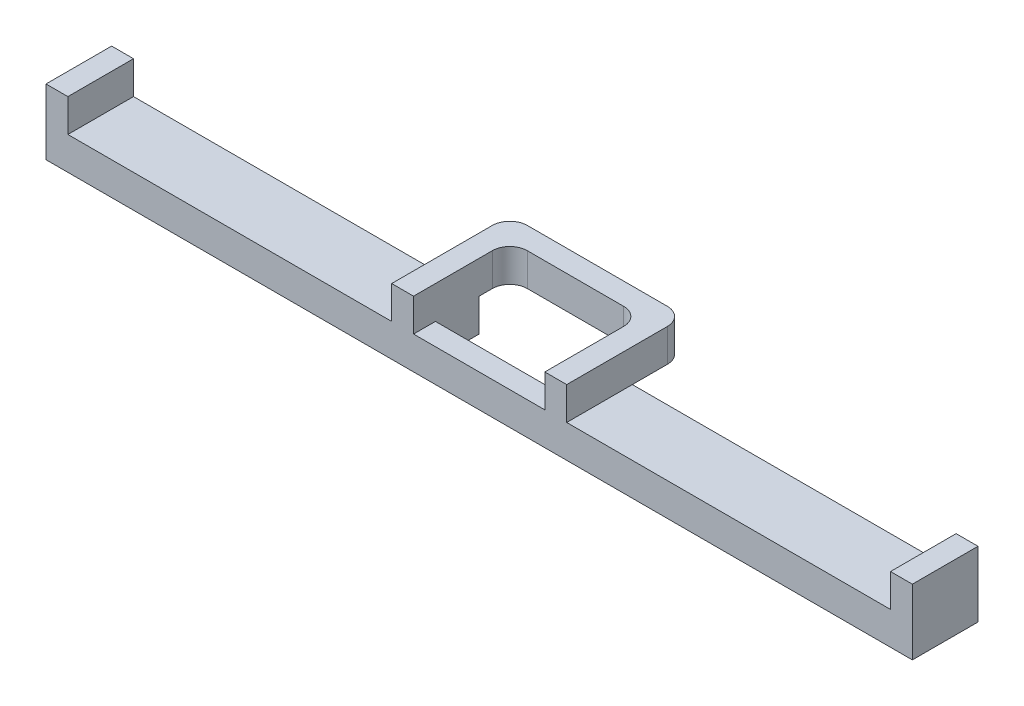
ISO-10303-21;
HEADER;
FILE_DESCRIPTION(('STEP AP214'),'2;1');
FILE_NAME('part.step','',(''),(''),'','','');
FILE_SCHEMA(('AUTOMOTIVE_DESIGN { 1 0 10303 214 1 1 1 1 }'));
ENDSEC;
DATA;
#1=APPLICATION_CONTEXT('core data for automotive mechanical design processes');
#2=APPLICATION_PROTOCOL_DEFINITION('international standard','automotive_design',2000,#1);
#3=PRODUCT_CONTEXT('',#1,'mechanical');
#4=PRODUCT('Part','Part','',(#3));
#5=PRODUCT_RELATED_PRODUCT_CATEGORY('part','',(#4));
#6=PRODUCT_DEFINITION_FORMATION('','',#4);
#7=PRODUCT_DEFINITION_CONTEXT('part definition',#1,'design');
#8=PRODUCT_DEFINITION('design','',#6,#7);
#9=PRODUCT_DEFINITION_SHAPE('','',#8);
#10=(LENGTH_UNIT() NAMED_UNIT(*) SI_UNIT(.MILLI.,.METRE.));
#11=(NAMED_UNIT(*) PLANE_ANGLE_UNIT() SI_UNIT($,.RADIAN.));
#12=(NAMED_UNIT(*) SI_UNIT($,.STERADIAN.) SOLID_ANGLE_UNIT());
#13=UNCERTAINTY_MEASURE_WITH_UNIT(LENGTH_MEASURE(1.E-05),#10,'distance_accuracy_value','');
#14=(GEOMETRIC_REPRESENTATION_CONTEXT(3) GLOBAL_UNCERTAINTY_ASSIGNED_CONTEXT((#13)) GLOBAL_UNIT_ASSIGNED_CONTEXT((#10,
#11,#12)) REPRESENTATION_CONTEXT('',''));
#15=CARTESIAN_POINT('',(0.,0.,0.));
#16=DIRECTION('',(0.,0.,1.));
#17=DIRECTION('',(1.,0.,0.));
#18=AXIS2_PLACEMENT_3D('',#15,#16,#17);
#19=CARTESIAN_POINT('',(0.,0.,0.));
#20=DIRECTION('',(0.,0.,-1.));
#21=DIRECTION('',(-1.,0.,0.));
#22=AXIS2_PLACEMENT_3D('',#19,#20,#21);
#23=PLANE('',#22);
#24=DIRECTION('',(-1.,0.,0.));
#25=VECTOR('',#24,1.);
#26=CARTESIAN_POINT('',(-94.,0.,0.));
#27=LINE('',#26,#25);
#28=CARTESIAN_POINT('',(-20.,0.,0.));
#29=VERTEX_POINT('',#28);
#30=CARTESIAN_POINT('',(-94.,0.,0.));
#31=VERTEX_POINT('',#30);
#32=EDGE_CURVE('E357',#29,#31,#27,.T.);
#33=ORIENTED_EDGE('',*,*,#32,.F.);
#34=DIRECTION('',(1.,0.,0.));
#35=VECTOR('',#34,1.);
#36=CARTESIAN_POINT('',(0.,0.,0.));
#37=LINE('',#36,#35);
#38=CARTESIAN_POINT('',(-15.,0.,0.));
#39=VERTEX_POINT('',#38);
#40=EDGE_CURVE('E232',#29,#39,#37,.T.);
#41=ORIENTED_EDGE('',*,*,#40,.T.);
#42=DIRECTION('',(0.,1.,0.));
#43=VECTOR('',#42,1.);
#44=CARTESIAN_POINT('',(-15.,7.50000000000001,0.));
#45=LINE('',#44,#43);
#46=CARTESIAN_POINT('',(-15.,-7.50000000000003,0.));
#47=VERTEX_POINT('',#46);
#48=EDGE_CURVE('E305',#47,#39,#45,.T.);
#49=ORIENTED_EDGE('',*,*,#48,.F.);
#50=DIRECTION('',(1.,0.,0.));
#51=VECTOR('',#50,1.);
#52=CARTESIAN_POINT('',(99.,-7.49999999999999,0.));
#53=LINE('',#52,#51);
#54=CARTESIAN_POINT('',(-99.,-7.50000000000001,0.));
#55=VERTEX_POINT('',#54);
#56=EDGE_CURVE('E348',#55,#47,#53,.T.);
#57=ORIENTED_EDGE('',*,*,#56,.F.);
#58=DIRECTION('',(0.,-1.,0.));
#59=VECTOR('',#58,1.);
#60=CARTESIAN_POINT('',(-99.,7.49999999999999,0.));
#61=LINE('',#60,#59);
#62=CARTESIAN_POINT('',(-99.,7.49999999999999,0.));
#63=VERTEX_POINT('',#62);
#64=EDGE_CURVE('E322',#63,#55,#61,.T.);
#65=ORIENTED_EDGE('',*,*,#64,.F.);
#66=DIRECTION('',(-1.,0.,0.));
#67=VECTOR('',#66,1.);
#68=CARTESIAN_POINT('',(-94.,7.49999999999999,0.));
#69=LINE('',#68,#67);
#70=CARTESIAN_POINT('',(-94.,7.49999999999999,0.));
#71=VERTEX_POINT('',#70);
#72=EDGE_CURVE('E327',#71,#63,#69,.T.);
#73=ORIENTED_EDGE('',*,*,#72,.F.);
#74=DIRECTION('',(0.,1.,0.));
#75=VECTOR('',#74,1.);
#76=CARTESIAN_POINT('',(-94.,7.49999999999999,0.));
#77=LINE('',#76,#75);
#78=EDGE_CURVE('E361',#31,#71,#77,.T.);
#79=ORIENTED_EDGE('',*,*,#78,.F.);
#80=EDGE_LOOP('',(#33,#41,#49,#57,#65,#73,#79));
#81=FACE_BOUND('',#80,.T.);
#82=ADVANCED_FACE('F35',(#81),#23,.T.);
#83=DIRECTION('',(0.,-1.,0.));
#84=VECTOR('',#83,1.);
#85=CARTESIAN_POINT('',(15.,7.50000000000002,0.));
#86=LINE('',#85,#84);
#87=CARTESIAN_POINT('',(15.,0.,0.));
#88=VERTEX_POINT('',#87);
#89=CARTESIAN_POINT('',(15.,-7.50000000000003,0.));
#90=VERTEX_POINT('',#89);
#91=EDGE_CURVE('E308',#88,#90,#86,.T.);
#92=ORIENTED_EDGE('',*,*,#91,.F.);
#93=DIRECTION('',(1.,0.,0.));
#94=VECTOR('',#93,1.);
#95=CARTESIAN_POINT('',(20.,0.,0.));
#96=LINE('',#95,#94);
#97=CARTESIAN_POINT('',(20.,0.,0.));
#98=VERTEX_POINT('',#97);
#99=EDGE_CURVE('E50',#88,#98,#96,.T.);
#100=ORIENTED_EDGE('',*,*,#99,.T.);
#101=CARTESIAN_POINT('',(94.,0.,0.));
#102=VERTEX_POINT('',#101);
#103=EDGE_CURVE('E358',#102,#98,#27,.T.);
#104=ORIENTED_EDGE('',*,*,#103,.F.);
#105=DIRECTION('',(0.,-1.,0.));
#106=VECTOR('',#105,1.);
#107=CARTESIAN_POINT('',(94.,7.50000000000002,0.));
#108=LINE('',#107,#106);
#109=CARTESIAN_POINT('',(94.,7.50000000000002,0.));
#110=VERTEX_POINT('',#109);
#111=EDGE_CURVE('E355',#110,#102,#108,.T.);
#112=ORIENTED_EDGE('',*,*,#111,.F.);
#113=DIRECTION('',(-1.,0.,0.));
#114=VECTOR('',#113,1.);
#115=CARTESIAN_POINT('',(99.,7.50000000000001,0.));
#116=LINE('',#115,#114);
#117=CARTESIAN_POINT('',(99.,7.50000000000001,0.));
#118=VERTEX_POINT('',#117);
#119=EDGE_CURVE('E353',#118,#110,#116,.T.);
#120=ORIENTED_EDGE('',*,*,#119,.F.);
#121=DIRECTION('',(0.,1.,0.));
#122=VECTOR('',#121,1.);
#123=CARTESIAN_POINT('',(99.,7.50000000000001,0.));
#124=LINE('',#123,#122);
#125=CARTESIAN_POINT('',(99.,-7.49999999999999,0.));
#126=VERTEX_POINT('',#125);
#127=EDGE_CURVE('E351',#126,#118,#124,.T.);
#128=ORIENTED_EDGE('',*,*,#127,.F.);
#129=EDGE_CURVE('E347',#90,#126,#53,.T.);
#130=ORIENTED_EDGE('',*,*,#129,.F.);
#131=EDGE_LOOP('',(#92,#100,#104,#112,#120,#128,#130));
#132=FACE_BOUND('',#131,.T.);
#133=ADVANCED_FACE('F392',(#132),#23,.T.);
#134=CARTESIAN_POINT('',(-94.,0.,15.));
#135=DIRECTION('',(0.,-1.,0.));
#136=DIRECTION('',(1.,0.,0.));
#137=AXIS2_PLACEMENT_3D('',#134,#135,#136);
#138=PLANE('',#137);
#139=ORIENTED_EDGE('',*,*,#103,.T.);
#140=DIRECTION('',(0.,0.,1.));
#141=VECTOR('',#140,1.);
#142=CARTESIAN_POINT('',(20.,0.,15.));
#143=LINE('',#142,#141);
#144=CARTESIAN_POINT('',(20.,0.,15.));
#145=VERTEX_POINT('',#144);
#146=EDGE_CURVE('E216',#98,#145,#143,.T.);
#147=ORIENTED_EDGE('',*,*,#146,.T.);
#148=DIRECTION('',(-1.,0.,0.));
#149=VECTOR('',#148,1.);
#150=CARTESIAN_POINT('',(-94.,0.,15.));
#151=LINE('',#150,#149);
#152=CARTESIAN_POINT('',(94.,0.,15.));
#153=VERTEX_POINT('',#152);
#154=EDGE_CURVE('E336',#153,#145,#151,.T.);
#155=ORIENTED_EDGE('',*,*,#154,.F.);
#156=DIRECTION('',(0.,0.,-1.));
#157=VECTOR('',#156,1.);
#158=CARTESIAN_POINT('',(94.,0.,15.));
#159=LINE('',#158,#157);
#160=EDGE_CURVE('E372',#153,#102,#159,.T.);
#161=ORIENTED_EDGE('',*,*,#160,.T.);
#162=EDGE_LOOP('',(#139,#147,#155,#161));
#163=FACE_BOUND('',#162,.T.);
#164=ADVANCED_FACE('F436',(#163),#138,.F.);
#165=CARTESIAN_POINT('',(-20.,0.,15.));
#166=VERTEX_POINT('',#165);
#167=CARTESIAN_POINT('',(-94.,0.,15.));
#168=VERTEX_POINT('',#167);
#169=EDGE_CURVE('E335',#166,#168,#151,.T.);
#170=ORIENTED_EDGE('',*,*,#169,.F.);
#171=DIRECTION('',(0.,0.,-1.));
#172=VECTOR('',#171,1.);
#173=CARTESIAN_POINT('',(-20.,0.,15.));
#174=LINE('',#173,#172);
#175=EDGE_CURVE('E320',#166,#29,#174,.T.);
#176=ORIENTED_EDGE('',*,*,#175,.T.);
#177=ORIENTED_EDGE('',*,*,#32,.T.);
#178=DIRECTION('',(0.,0.,-1.));
#179=VECTOR('',#178,1.);
#180=CARTESIAN_POINT('',(-94.,0.,15.));
#181=LINE('',#180,#179);
#182=EDGE_CURVE('E369',#168,#31,#181,.T.);
#183=ORIENTED_EDGE('',*,*,#182,.F.);
#184=EDGE_LOOP('',(#170,#176,#177,#183));
#185=FACE_BOUND('',#184,.T.);
#186=ADVANCED_FACE('F438',(#185),#138,.F.);
#187=CARTESIAN_POINT('',(-99.,7.49999999999999,15.));
#188=DIRECTION('',(1.,0.,0.));
#189=DIRECTION('',(0.,0.,-1.));
#190=AXIS2_PLACEMENT_3D('',#187,#188,#189);
#191=PLANE('',#190);
#192=ORIENTED_EDGE('',*,*,#64,.T.);
#193=DIRECTION('',(0.,0.,-1.));
#194=VECTOR('',#193,1.);
#195=CARTESIAN_POINT('',(-99.,-7.50000000000001,15.));
#196=LINE('',#195,#194);
#197=CARTESIAN_POINT('',(-99.,-7.50000000000001,15.));
#198=VERTEX_POINT('',#197);
#199=EDGE_CURVE('E11',#198,#55,#196,.T.);
#200=ORIENTED_EDGE('',*,*,#199,.F.);
#201=DIRECTION('',(0.,-1.,0.));
#202=VECTOR('',#201,1.);
#203=CARTESIAN_POINT('',(-99.,7.49999999999999,15.));
#204=LINE('',#203,#202);
#205=CARTESIAN_POINT('',(-99.,7.49999999999999,15.));
#206=VERTEX_POINT('',#205);
#207=EDGE_CURVE('E323',#206,#198,#204,.T.);
#208=ORIENTED_EDGE('',*,*,#207,.F.);
#209=DIRECTION('',(0.,0.,-1.));
#210=VECTOR('',#209,1.);
#211=CARTESIAN_POINT('',(-99.,7.49999999999999,15.));
#212=LINE('',#211,#210);
#213=EDGE_CURVE('E344',#206,#63,#212,.T.);
#214=ORIENTED_EDGE('',*,*,#213,.T.);
#215=EDGE_LOOP('',(#192,#200,#208,#214));
#216=FACE_BOUND('',#215,.T.);
#217=ADVANCED_FACE('F37',(#216),#191,.F.);
#218=CARTESIAN_POINT('',(99.,-7.49999999999999,15.));
#219=DIRECTION('',(0.,1.,0.));
#220=DIRECTION('',(-1.,0.,0.));
#221=AXIS2_PLACEMENT_3D('',#218,#219,#220);
#222=PLANE('',#221);
#223=ORIENTED_EDGE('',*,*,#56,.T.);
#224=DIRECTION('',(0.,0.,1.));
#225=VECTOR('',#224,1.);
#226=CARTESIAN_POINT('',(-15.,-7.50000000000003,0.));
#227=LINE('',#226,#225);
#228=CARTESIAN_POINT('',(-15.,-7.50000000000003,10.));
#229=VERTEX_POINT('',#228);
#230=EDGE_CURVE('E235',#47,#229,#227,.T.);
#231=ORIENTED_EDGE('',*,*,#230,.T.);
#232=DIRECTION('',(1.,0.,0.));
#233=VECTOR('',#232,1.);
#234=CARTESIAN_POINT('',(-15.,-7.50000000000003,10.));
#235=LINE('',#234,#233);
#236=CARTESIAN_POINT('',(15.,-7.50000000000003,10.));
#237=VERTEX_POINT('',#236);
#238=EDGE_CURVE('E277',#229,#237,#235,.T.);
#239=ORIENTED_EDGE('',*,*,#238,.T.);
#240=DIRECTION('',(0.,0.,-1.));
#241=VECTOR('',#240,1.);
#242=CARTESIAN_POINT('',(15.,-7.50000000000003,0.));
#243=LINE('',#242,#241);
#244=EDGE_CURVE('E280',#237,#90,#243,.T.);
#245=ORIENTED_EDGE('',*,*,#244,.T.);
#246=ORIENTED_EDGE('',*,*,#129,.T.);
#247=DIRECTION('',(0.,0.,-1.));
#248=VECTOR('',#247,1.);
#249=CARTESIAN_POINT('',(99.,-7.49999999999999,15.));
#250=LINE('',#249,#248);
#251=CARTESIAN_POINT('',(99.,-7.49999999999999,15.));
#252=VERTEX_POINT('',#251);
#253=EDGE_CURVE('E43',#252,#126,#250,.T.);
#254=ORIENTED_EDGE('',*,*,#253,.F.);
#255=DIRECTION('',(1.,0.,0.));
#256=VECTOR('',#255,1.);
#257=CARTESIAN_POINT('',(99.,-7.49999999999999,15.));
#258=LINE('',#257,#256);
#259=EDGE_CURVE('E326',#198,#252,#258,.T.);
#260=ORIENTED_EDGE('',*,*,#259,.F.);
#261=ORIENTED_EDGE('',*,*,#199,.T.);
#262=EDGE_LOOP('',(#223,#231,#239,#245,#246,#254,#260,#261));
#263=FACE_BOUND('',#262,.T.);
#264=ADVANCED_FACE('F408',(#263),#222,.F.);
#265=CARTESIAN_POINT('',(99.,7.50000000000001,15.));
#266=DIRECTION('',(-1.,0.,0.));
#267=DIRECTION('',(0.,0.,1.));
#268=AXIS2_PLACEMENT_3D('',#265,#266,#267);
#269=PLANE('',#268);
#270=ORIENTED_EDGE('',*,*,#127,.T.);
#271=DIRECTION('',(0.,0.,-1.));
#272=VECTOR('',#271,1.);
#273=CARTESIAN_POINT('',(99.,7.50000000000001,15.));
#274=LINE('',#273,#272);
#275=CARTESIAN_POINT('',(99.,7.50000000000001,15.));
#276=VERTEX_POINT('',#275);
#277=EDGE_CURVE('E378',#276,#118,#274,.T.);
#278=ORIENTED_EDGE('',*,*,#277,.F.);
#279=DIRECTION('',(0.,1.,0.));
#280=VECTOR('',#279,1.);
#281=CARTESIAN_POINT('',(99.,7.50000000000001,15.));
#282=LINE('',#281,#280);
#283=EDGE_CURVE('E329',#252,#276,#282,.T.);
#284=ORIENTED_EDGE('',*,*,#283,.F.);
#285=ORIENTED_EDGE('',*,*,#253,.T.);
#286=EDGE_LOOP('',(#270,#278,#284,#285));
#287=FACE_BOUND('',#286,.T.);
#288=ADVANCED_FACE('F385',(#287),#269,.F.);
#289=CARTESIAN_POINT('',(99.,7.50000000000001,15.));
#290=DIRECTION('',(0.,-1.,0.));
#291=DIRECTION('',(1.,0.,0.));
#292=AXIS2_PLACEMENT_3D('',#289,#290,#291);
#293=PLANE('',#292);
#294=ORIENTED_EDGE('',*,*,#119,.T.);
#295=DIRECTION('',(0.,0.,-1.));
#296=VECTOR('',#295,1.);
#297=CARTESIAN_POINT('',(94.,7.50000000000002,15.));
#298=LINE('',#297,#296);
#299=CARTESIAN_POINT('',(94.,7.50000000000002,15.));
#300=VERTEX_POINT('',#299);
#301=EDGE_CURVE('E375',#300,#110,#298,.T.);
#302=ORIENTED_EDGE('',*,*,#301,.F.);
#303=DIRECTION('',(-1.,0.,0.));
#304=VECTOR('',#303,1.);
#305=CARTESIAN_POINT('',(99.,7.50000000000001,15.));
#306=LINE('',#305,#304);
#307=EDGE_CURVE('E331',#276,#300,#306,.T.);
#308=ORIENTED_EDGE('',*,*,#307,.F.);
#309=ORIENTED_EDGE('',*,*,#277,.T.);
#310=EDGE_LOOP('',(#294,#302,#308,#309));
#311=FACE_BOUND('',#310,.T.);
#312=ADVANCED_FACE('F397',(#311),#293,.F.);
#313=CARTESIAN_POINT('',(94.,7.50000000000002,15.));
#314=DIRECTION('',(1.,0.,0.));
#315=DIRECTION('',(0.,0.,-1.));
#316=AXIS2_PLACEMENT_3D('',#313,#314,#315);
#317=PLANE('',#316);
#318=ORIENTED_EDGE('',*,*,#111,.T.);
#319=ORIENTED_EDGE('',*,*,#160,.F.);
#320=DIRECTION('',(0.,-1.,0.));
#321=VECTOR('',#320,1.);
#322=CARTESIAN_POINT('',(94.,7.50000000000002,15.));
#323=LINE('',#322,#321);
#324=EDGE_CURVE('E333',#300,#153,#323,.T.);
#325=ORIENTED_EDGE('',*,*,#324,.F.);
#326=ORIENTED_EDGE('',*,*,#301,.T.);
#327=EDGE_LOOP('',(#318,#319,#325,#326));
#328=FACE_BOUND('',#327,.T.);
#329=ADVANCED_FACE('F401',(#328),#317,.F.);
#330=DIRECTION('',(0.,0.,1.));
#331=VECTOR('',#330,1.);
#332=CARTESIAN_POINT('',(15.,0.,-42.7200187265877));
#333=LINE('',#332,#331);
#334=CARTESIAN_POINT('',(15.,0.,10.));
#335=VERTEX_POINT('',#334);
#336=CARTESIAN_POINT('',(15.,0.,15.));
#337=VERTEX_POINT('',#336);
#338=EDGE_CURVE('E310',#335,#337,#333,.T.);
#339=ORIENTED_EDGE('',*,*,#338,.F.);
#340=DIRECTION('',(-1.,0.,0.));
#341=VECTOR('',#340,1.);
#342=CARTESIAN_POINT('',(-94.,0.,10.));
#343=LINE('',#342,#341);
#344=CARTESIAN_POINT('',(-15.,0.,10.));
#345=VERTEX_POINT('',#344);
#346=EDGE_CURVE('E287',#335,#345,#343,.T.);
#347=ORIENTED_EDGE('',*,*,#346,.T.);
#348=DIRECTION('',(0.,0.,1.));
#349=VECTOR('',#348,1.);
#350=CARTESIAN_POINT('',(-15.,0.,-42.7200187265877));
#351=LINE('',#350,#349);
#352=CARTESIAN_POINT('',(-15.,0.,15.));
#353=VERTEX_POINT('',#352);
#354=EDGE_CURVE('E58',#345,#353,#351,.T.);
#355=ORIENTED_EDGE('',*,*,#354,.T.);
#356=EDGE_CURVE('E340',#337,#353,#151,.T.);
#357=ORIENTED_EDGE('',*,*,#356,.F.);
#358=EDGE_LOOP('',(#339,#347,#355,#357));
#359=FACE_BOUND('',#358,.T.);
#360=ADVANCED_FACE('F440',(#359),#138,.F.);
#361=CARTESIAN_POINT('',(-94.,7.49999999999999,15.));
#362=DIRECTION('',(-1.,0.,0.));
#363=DIRECTION('',(0.,0.,1.));
#364=AXIS2_PLACEMENT_3D('',#361,#362,#363);
#365=PLANE('',#364);
#366=ORIENTED_EDGE('',*,*,#78,.T.);
#367=DIRECTION('',(0.,0.,-1.));
#368=VECTOR('',#367,1.);
#369=CARTESIAN_POINT('',(-94.,7.49999999999999,15.));
#370=LINE('',#369,#368);
#371=CARTESIAN_POINT('',(-94.,7.49999999999999,15.));
#372=VERTEX_POINT('',#371);
#373=EDGE_CURVE('E366',#372,#71,#370,.T.);
#374=ORIENTED_EDGE('',*,*,#373,.F.);
#375=DIRECTION('',(0.,1.,0.));
#376=VECTOR('',#375,1.);
#377=CARTESIAN_POINT('',(-94.,7.49999999999999,15.));
#378=LINE('',#377,#376);
#379=EDGE_CURVE('E339',#168,#372,#378,.T.);
#380=ORIENTED_EDGE('',*,*,#379,.F.);
#381=ORIENTED_EDGE('',*,*,#182,.T.);
#382=EDGE_LOOP('',(#366,#374,#380,#381));
#383=FACE_BOUND('',#382,.T.);
#384=ADVANCED_FACE('F450',(#383),#365,.F.);
#385=CARTESIAN_POINT('',(-94.,7.49999999999999,15.));
#386=DIRECTION('',(0.,-1.,0.));
#387=DIRECTION('',(0.,0.,-1.));
#388=AXIS2_PLACEMENT_3D('',#385,#386,#387);
#389=PLANE('',#388);
#390=ORIENTED_EDGE('',*,*,#72,.T.);
#391=ORIENTED_EDGE('',*,*,#213,.F.);
#392=DIRECTION('',(-1.,0.,0.));
#393=VECTOR('',#392,1.);
#394=CARTESIAN_POINT('',(-94.,7.49999999999999,15.));
#395=LINE('',#394,#393);
#396=EDGE_CURVE('E342',#372,#206,#395,.T.);
#397=ORIENTED_EDGE('',*,*,#396,.F.);
#398=ORIENTED_EDGE('',*,*,#373,.T.);
#399=EDGE_LOOP('',(#390,#391,#397,#398));
#400=FACE_BOUND('',#399,.T.);
#401=ADVANCED_FACE('F458',(#400),#389,.F.);
#402=CARTESIAN_POINT('',(0.,0.,15.));
#403=DIRECTION('',(0.,0.,-1.));
#404=DIRECTION('',(-1.,0.,0.));
#405=AXIS2_PLACEMENT_3D('',#402,#403,#404);
#406=PLANE('',#405);
#407=ORIENTED_EDGE('',*,*,#154,.T.);
#408=DIRECTION('',(0.,1.,0.));
#409=VECTOR('',#408,1.);
#410=CARTESIAN_POINT('',(20.,-7.50000000000001,15.));
#411=LINE('',#410,#409);
#412=CARTESIAN_POINT('',(20.,7.50000000000001,15.));
#413=VERTEX_POINT('',#412);
#414=EDGE_CURVE('E301',#145,#413,#411,.T.);
#415=ORIENTED_EDGE('',*,*,#414,.T.);
#416=DIRECTION('',(-1.,0.,0.));
#417=VECTOR('',#416,1.);
#418=CARTESIAN_POINT('',(20.,7.50000000000001,15.));
#419=LINE('',#418,#417);
#420=CARTESIAN_POINT('',(15.,7.50000000000002,15.));
#421=VERTEX_POINT('',#420);
#422=EDGE_CURVE('E298',#413,#421,#419,.T.);
#423=ORIENTED_EDGE('',*,*,#422,.T.);
#424=DIRECTION('',(0.,-1.,0.));
#425=VECTOR('',#424,1.);
#426=CARTESIAN_POINT('',(15.,7.50000000000002,15.));
#427=LINE('',#426,#425);
#428=EDGE_CURVE('E295',#421,#337,#427,.T.);
#429=ORIENTED_EDGE('',*,*,#428,.T.);
#430=ORIENTED_EDGE('',*,*,#356,.T.);
#431=DIRECTION('',(0.,1.,0.));
#432=VECTOR('',#431,1.);
#433=CARTESIAN_POINT('',(-15.,7.50000000000001,15.));
#434=LINE('',#433,#432);
#435=CARTESIAN_POINT('',(-15.,7.50000000000001,15.));
#436=VERTEX_POINT('',#435);
#437=EDGE_CURVE('E291',#353,#436,#434,.T.);
#438=ORIENTED_EDGE('',*,*,#437,.T.);
#439=DIRECTION('',(-1.,0.,0.));
#440=VECTOR('',#439,1.);
#441=CARTESIAN_POINT('',(-15.,7.50000000000001,15.));
#442=LINE('',#441,#440);
#443=CARTESIAN_POINT('',(-20.,7.50000000000001,15.));
#444=VERTEX_POINT('',#443);
#445=EDGE_CURVE('E290',#436,#444,#442,.T.);
#446=ORIENTED_EDGE('',*,*,#445,.T.);
#447=DIRECTION('',(0.,-1.,0.));
#448=VECTOR('',#447,1.);
#449=CARTESIAN_POINT('',(-20.,-7.50000000000001,15.));
#450=LINE('',#449,#448);
#451=EDGE_CURVE('E211',#444,#166,#450,.T.);
#452=ORIENTED_EDGE('',*,*,#451,.T.);
#453=ORIENTED_EDGE('',*,*,#169,.T.);
#454=ORIENTED_EDGE('',*,*,#379,.T.);
#455=ORIENTED_EDGE('',*,*,#396,.T.);
#456=ORIENTED_EDGE('',*,*,#207,.T.);
#457=ORIENTED_EDGE('',*,*,#259,.T.);
#458=ORIENTED_EDGE('',*,*,#283,.T.);
#459=ORIENTED_EDGE('',*,*,#307,.T.);
#460=ORIENTED_EDGE('',*,*,#324,.T.);
#461=EDGE_LOOP('',(#407,#415,#423,#429,#430,#438,#446,#452,#453,#454,#455,#456,#457,#458,#459,#460));
#462=FACE_BOUND('',#461,.T.);
#463=ADVANCED_FACE('F405',(#462),#406,.F.);
#464=CARTESIAN_POINT('',(-15.,7.50000000000001,-42.7200187265877));
#465=DIRECTION('',(1.,0.,0.));
#466=DIRECTION('',(0.,0.,-1.));
#467=AXIS2_PLACEMENT_3D('',#464,#465,#466);
#468=PLANE('',#467);
#469=DIRECTION('',(0.,0.,1.));
#470=VECTOR('',#469,1.);
#471=CARTESIAN_POINT('',(-15.,7.50000000000001,-42.7200187265877));
#472=LINE('',#471,#470);
#473=CARTESIAN_POINT('',(-15.,7.50000000000001,-3.));
#474=VERTEX_POINT('',#473);
#475=EDGE_CURVE('E217',#474,#436,#472,.T.);
#476=ORIENTED_EDGE('',*,*,#475,.T.);
#477=ORIENTED_EDGE('',*,*,#437,.F.);
#478=ORIENTED_EDGE('',*,*,#354,.F.);
#479=DIRECTION('',(0.,1.,0.));
#480=VECTOR('',#479,1.);
#481=CARTESIAN_POINT('',(-15.,-7.50000000000003,10.));
#482=LINE('',#481,#480);
#483=EDGE_CURVE('E283',#229,#345,#482,.T.);
#484=ORIENTED_EDGE('',*,*,#483,.F.);
#485=ORIENTED_EDGE('',*,*,#230,.F.);
#486=ORIENTED_EDGE('',*,*,#48,.T.);
#487=DIRECTION('',(0.,0.,-1.));
#488=VECTOR('',#487,1.);
#489=CARTESIAN_POINT('',(-15.,0.,11.1766830948938));
#490=LINE('',#489,#488);
#491=CARTESIAN_POINT('',(-15.,0.,-3.));
#492=VERTEX_POINT('',#491);
#493=EDGE_CURVE('E240',#39,#492,#490,.T.);
#494=ORIENTED_EDGE('',*,*,#493,.T.);
#495=DIRECTION('',(0.,-1.,0.));
#496=VECTOR('',#495,1.);
#497=CARTESIAN_POINT('',(-15.,53.7294131401334,-3.));
#498=LINE('',#497,#496);
#499=EDGE_CURVE('E253',#474,#492,#498,.T.);
#500=ORIENTED_EDGE('',*,*,#499,.F.);
#501=EDGE_LOOP('',(#476,#477,#478,#484,#485,#486,#494,#500));
#502=FACE_BOUND('',#501,.T.);
#503=ADVANCED_FACE('F419',(#502),#468,.T.);
#504=CARTESIAN_POINT('',(-20.,-7.50000000000001,-42.7200187265877));
#505=DIRECTION('',(-1.,0.,0.));
#506=DIRECTION('',(0.,0.,1.));
#507=AXIS2_PLACEMENT_3D('',#504,#505,#506);
#508=PLANE('',#507);
#509=DIRECTION('',(0.,0.,1.));
#510=VECTOR('',#509,1.);
#511=CARTESIAN_POINT('',(-20.,0.,11.1766830948938));
#512=LINE('',#511,#510);
#513=CARTESIAN_POINT('',(-20.,0.,-8.));
#514=VERTEX_POINT('',#513);
#515=EDGE_CURVE('E226',#514,#29,#512,.T.);
#516=ORIENTED_EDGE('',*,*,#515,.T.);
#517=ORIENTED_EDGE('',*,*,#175,.F.);
#518=ORIENTED_EDGE('',*,*,#451,.F.);
#519=DIRECTION('',(0.,0.,1.));
#520=VECTOR('',#519,1.);
#521=CARTESIAN_POINT('',(-20.,7.50000000000001,-42.7200187265877));
#522=LINE('',#521,#520);
#523=CARTESIAN_POINT('',(-20.,7.50000000000001,-8.));
#524=VERTEX_POINT('',#523);
#525=EDGE_CURVE('E204',#524,#444,#522,.T.);
#526=ORIENTED_EDGE('',*,*,#525,.F.);
#527=DIRECTION('',(0.,-1.,0.));
#528=VECTOR('',#527,1.);
#529=CARTESIAN_POINT('',(-20.,53.7294131401334,-8.));
#530=LINE('',#529,#528);
#531=EDGE_CURVE('E208',#524,#514,#530,.T.);
#532=ORIENTED_EDGE('',*,*,#531,.T.);
#533=EDGE_LOOP('',(#516,#517,#518,#526,#532));
#534=FACE_BOUND('',#533,.T.);
#535=ADVANCED_FACE('F207',(#534),#508,.T.);
#536=CARTESIAN_POINT('',(20.,-7.50000000000001,-42.7200187265877));
#537=DIRECTION('',(1.,0.,0.));
#538=DIRECTION('',(0.,0.,-1.));
#539=AXIS2_PLACEMENT_3D('',#536,#537,#538);
#540=PLANE('',#539);
#541=ORIENTED_EDGE('',*,*,#146,.F.);
#542=DIRECTION('',(0.,0.,-1.));
#543=VECTOR('',#542,1.);
#544=CARTESIAN_POINT('',(20.,0.,-8.));
#545=LINE('',#544,#543);
#546=CARTESIAN_POINT('',(20.,0.,-8.));
#547=VERTEX_POINT('',#546);
#548=EDGE_CURVE('E269',#98,#547,#545,.T.);
#549=ORIENTED_EDGE('',*,*,#548,.T.);
#550=DIRECTION('',(0.,-1.,0.));
#551=VECTOR('',#550,1.);
#552=CARTESIAN_POINT('',(20.,53.7294131401334,-8.));
#553=LINE('',#552,#551);
#554=CARTESIAN_POINT('',(20.,7.50000000000001,-8.));
#555=VERTEX_POINT('',#554);
#556=EDGE_CURVE('E266',#555,#547,#553,.T.);
#557=ORIENTED_EDGE('',*,*,#556,.F.);
#558=DIRECTION('',(0.,0.,1.));
#559=VECTOR('',#558,1.);
#560=CARTESIAN_POINT('',(20.,7.50000000000001,-42.7200187265877));
#561=LINE('',#560,#559);
#562=EDGE_CURVE('E294',#555,#413,#561,.T.);
#563=ORIENTED_EDGE('',*,*,#562,.T.);
#564=ORIENTED_EDGE('',*,*,#414,.F.);
#565=EDGE_LOOP('',(#541,#549,#557,#563,#564));
#566=FACE_BOUND('',#565,.T.);
#567=ADVANCED_FACE('F432',(#566),#540,.T.);
#568=CARTESIAN_POINT('',(20.,7.50000000000001,-42.7200187265877));
#569=DIRECTION('',(0.,1.,0.));
#570=DIRECTION('',(-1.,0.,0.));
#571=AXIS2_PLACEMENT_3D('',#568,#569,#570);
#572=PLANE('',#571);
#573=ORIENTED_EDGE('',*,*,#562,.F.);
#574=CARTESIAN_POINT('',(16.,7.50000000000001,-8.));
#575=DIRECTION('',(0.,1.,0.));
#576=DIRECTION('',(0.,0.,1.));
#577=AXIS2_PLACEMENT_3D('',#574,#575,#576);
#578=CIRCLE('',#577,4.);
#579=CARTESIAN_POINT('',(16.,7.50000000000001,-12.));
#580=VERTEX_POINT('',#579);
#581=EDGE_CURVE('E237',#555,#580,#578,.T.);
#582=ORIENTED_EDGE('',*,*,#581,.T.);
#583=DIRECTION('',(-1.,0.,0.));
#584=VECTOR('',#583,1.);
#585=CARTESIAN_POINT('',(-16.,7.50000000000001,-12.));
#586=LINE('',#585,#584);
#587=CARTESIAN_POINT('',(-16.,7.50000000000001,-12.));
#588=VERTEX_POINT('',#587);
#589=EDGE_CURVE('E231',#580,#588,#586,.T.);
#590=ORIENTED_EDGE('',*,*,#589,.T.);
#591=CARTESIAN_POINT('',(-16.,7.50000000000001,-8.));
#592=DIRECTION('',(0.,1.,0.));
#593=DIRECTION('',(0.,0.,1.));
#594=AXIS2_PLACEMENT_3D('',#591,#592,#593);
#595=CIRCLE('',#594,4.);
#596=EDGE_CURVE('E221',#588,#524,#595,.T.);
#597=ORIENTED_EDGE('',*,*,#596,.T.);
#598=ORIENTED_EDGE('',*,*,#525,.T.);
#599=ORIENTED_EDGE('',*,*,#445,.F.);
#600=ORIENTED_EDGE('',*,*,#475,.F.);
#601=CARTESIAN_POINT('',(-11.,7.50000000000001,-3.));
#602=DIRECTION('',(0.,1.,0.));
#603=DIRECTION('',(0.,0.,1.));
#604=AXIS2_PLACEMENT_3D('',#601,#602,#603);
#605=CIRCLE('',#604,4.);
#606=CARTESIAN_POINT('',(-11.,7.50000000000001,-7.));
#607=VERTEX_POINT('',#606);
#608=EDGE_CURVE('E250',#474,#607,#605,.F.);
#609=ORIENTED_EDGE('',*,*,#608,.T.);
#610=DIRECTION('',(1.,0.,0.));
#611=VECTOR('',#610,1.);
#612=CARTESIAN_POINT('',(-11.,7.50000000000001,-7.));
#613=LINE('',#612,#611);
#614=CARTESIAN_POINT('',(11.,7.50000000000001,-7.));
#615=VERTEX_POINT('',#614);
#616=EDGE_CURVE('E247',#607,#615,#613,.T.);
#617=ORIENTED_EDGE('',*,*,#616,.T.);
#618=CARTESIAN_POINT('',(11.,7.50000000000001,-3.));
#619=DIRECTION('',(0.,1.,0.));
#620=DIRECTION('',(0.,0.,1.));
#621=AXIS2_PLACEMENT_3D('',#618,#619,#620);
#622=CIRCLE('',#621,4.);
#623=CARTESIAN_POINT('',(15.,7.50000000000001,-3.));
#624=VERTEX_POINT('',#623);
#625=EDGE_CURVE('E244',#615,#624,#622,.F.);
#626=ORIENTED_EDGE('',*,*,#625,.T.);
#627=DIRECTION('',(0.,0.,1.));
#628=VECTOR('',#627,1.);
#629=CARTESIAN_POINT('',(15.,7.50000000000002,-42.7200187265877));
#630=LINE('',#629,#628);
#631=EDGE_CURVE('E311',#624,#421,#630,.T.);
#632=ORIENTED_EDGE('',*,*,#631,.T.);
#633=ORIENTED_EDGE('',*,*,#422,.F.);
#634=EDGE_LOOP('',(#573,#582,#590,#597,#598,#599,#600,#609,#617,#626,#632,#633));
#635=FACE_BOUND('',#634,.T.);
#636=ADVANCED_FACE('F229',(#635),#572,.T.);
#637=CARTESIAN_POINT('',(15.,7.50000000000002,-42.7200187265877));
#638=DIRECTION('',(-1.,0.,0.));
#639=DIRECTION('',(0.,-1.,0.));
#640=AXIS2_PLACEMENT_3D('',#637,#638,#639);
#641=PLANE('',#640);
#642=ORIENTED_EDGE('',*,*,#428,.F.);
#643=ORIENTED_EDGE('',*,*,#631,.F.);
#644=DIRECTION('',(0.,-1.,0.));
#645=VECTOR('',#644,1.);
#646=CARTESIAN_POINT('',(15.,53.7294131401334,-3.));
#647=LINE('',#646,#645);
#648=CARTESIAN_POINT('',(15.,0.,-3.));
#649=VERTEX_POINT('',#648);
#650=EDGE_CURVE('E263',#624,#649,#647,.T.);
#651=ORIENTED_EDGE('',*,*,#650,.T.);
#652=DIRECTION('',(0.,0.,1.));
#653=VECTOR('',#652,1.);
#654=CARTESIAN_POINT('',(15.,0.,0.));
#655=LINE('',#654,#653);
#656=EDGE_CURVE('E265',#649,#88,#655,.T.);
#657=ORIENTED_EDGE('',*,*,#656,.T.);
#658=ORIENTED_EDGE('',*,*,#91,.T.);
#659=ORIENTED_EDGE('',*,*,#244,.F.);
#660=DIRECTION('',(0.,1.,0.));
#661=VECTOR('',#660,1.);
#662=CARTESIAN_POINT('',(15.,-7.50000000000003,10.));
#663=LINE('',#662,#661);
#664=EDGE_CURVE('E284',#237,#335,#663,.T.);
#665=ORIENTED_EDGE('',*,*,#664,.T.);
#666=ORIENTED_EDGE('',*,*,#338,.T.);
#667=EDGE_LOOP('',(#642,#643,#651,#657,#658,#659,#665,#666));
#668=FACE_BOUND('',#667,.T.);
#669=ADVANCED_FACE('F427',(#668),#641,.T.);
#670=CARTESIAN_POINT('',(-15.,-7.50000000000003,10.));
#671=DIRECTION('',(0.,0.,1.));
#672=DIRECTION('',(1.,0.,0.));
#673=AXIS2_PLACEMENT_3D('',#670,#671,#672);
#674=PLANE('',#673);
#675=ORIENTED_EDGE('',*,*,#664,.F.);
#676=ORIENTED_EDGE('',*,*,#238,.F.);
#677=ORIENTED_EDGE('',*,*,#483,.T.);
#678=ORIENTED_EDGE('',*,*,#346,.F.);
#679=EDGE_LOOP('',(#675,#676,#677,#678));
#680=FACE_BOUND('',#679,.T.);
#681=ADVANCED_FACE('F423',(#680),#674,.F.);
#682=CARTESIAN_POINT('',(-11.,53.7294131401334,-3.));
#683=DIRECTION('',(0.,-1.,0.));
#684=DIRECTION('',(1.,0.,0.));
#685=AXIS2_PLACEMENT_3D('',#682,#683,#684);
#686=CYLINDRICAL_SURFACE('',#685,4.);
#687=ORIENTED_EDGE('',*,*,#608,.F.);
#688=ORIENTED_EDGE('',*,*,#499,.T.);
#689=CARTESIAN_POINT('',(-11.,0.,-3.));
#690=DIRECTION('',(0.,-1.,0.));
#691=DIRECTION('',(-1.,0.,0.));
#692=AXIS2_PLACEMENT_3D('',#689,#690,#691);
#693=CIRCLE('',#692,4.);
#694=CARTESIAN_POINT('',(-11.,0.,-7.));
#695=VERTEX_POINT('',#694);
#696=EDGE_CURVE('E256',#492,#695,#693,.T.);
#697=ORIENTED_EDGE('',*,*,#696,.T.);
#698=DIRECTION('',(0.,-1.,0.));
#699=VECTOR('',#698,1.);
#700=CARTESIAN_POINT('',(-11.,53.7294131401334,-7.));
#701=LINE('',#700,#699);
#702=EDGE_CURVE('E257',#607,#695,#701,.T.);
#703=ORIENTED_EDGE('',*,*,#702,.F.);
#704=EDGE_LOOP('',(#687,#688,#697,#703));
#705=FACE_BOUND('',#704,.T.);
#706=ADVANCED_FACE('F490',(#705),#686,.F.);
#707=CARTESIAN_POINT('',(-11.,53.7294131401334,-7.));
#708=DIRECTION('',(0.,0.,-1.));
#709=DIRECTION('',(-1.,0.,0.));
#710=AXIS2_PLACEMENT_3D('',#707,#708,#709);
#711=PLANE('',#710);
#712=ORIENTED_EDGE('',*,*,#616,.F.);
#713=ORIENTED_EDGE('',*,*,#702,.T.);
#714=DIRECTION('',(1.,0.,0.));
#715=VECTOR('',#714,1.);
#716=CARTESIAN_POINT('',(-11.,0.,-7.));
#717=LINE('',#716,#715);
#718=CARTESIAN_POINT('',(11.,0.,-7.));
#719=VERTEX_POINT('',#718);
#720=EDGE_CURVE('E259',#695,#719,#717,.T.);
#721=ORIENTED_EDGE('',*,*,#720,.T.);
#722=DIRECTION('',(0.,-1.,0.));
#723=VECTOR('',#722,1.);
#724=CARTESIAN_POINT('',(11.,53.7294131401334,-7.));
#725=LINE('',#724,#723);
#726=EDGE_CURVE('E260',#615,#719,#725,.T.);
#727=ORIENTED_EDGE('',*,*,#726,.F.);
#728=EDGE_LOOP('',(#712,#713,#721,#727));
#729=FACE_BOUND('',#728,.T.);
#730=ADVANCED_FACE('F495',(#729),#711,.F.);
#731=CARTESIAN_POINT('',(11.,53.7294131401334,-3.));
#732=DIRECTION('',(0.,-1.,0.));
#733=DIRECTION('',(1.,0.,0.));
#734=AXIS2_PLACEMENT_3D('',#731,#732,#733);
#735=CYLINDRICAL_SURFACE('',#734,4.);
#736=ORIENTED_EDGE('',*,*,#625,.F.);
#737=ORIENTED_EDGE('',*,*,#726,.T.);
#738=CARTESIAN_POINT('',(11.,0.,-3.));
#739=DIRECTION('',(0.,-1.,0.));
#740=DIRECTION('',(-1.,0.,0.));
#741=AXIS2_PLACEMENT_3D('',#738,#739,#740);
#742=CIRCLE('',#741,4.);
#743=EDGE_CURVE('E262',#719,#649,#742,.T.);
#744=ORIENTED_EDGE('',*,*,#743,.T.);
#745=ORIENTED_EDGE('',*,*,#650,.F.);
#746=EDGE_LOOP('',(#736,#737,#744,#745));
#747=FACE_BOUND('',#746,.T.);
#748=ADVANCED_FACE('F513',(#747),#735,.F.);
#749=CARTESIAN_POINT('',(16.,53.7294131401334,-8.));
#750=DIRECTION('',(0.,-1.,0.));
#751=DIRECTION('',(1.,0.,0.));
#752=AXIS2_PLACEMENT_3D('',#749,#750,#751);
#753=CYLINDRICAL_SURFACE('',#752,4.);
#754=ORIENTED_EDGE('',*,*,#581,.F.);
#755=ORIENTED_EDGE('',*,*,#556,.T.);
#756=CARTESIAN_POINT('',(16.,0.,-8.));
#757=DIRECTION('',(0.,1.,0.));
#758=DIRECTION('',(1.,0.,0.));
#759=AXIS2_PLACEMENT_3D('',#756,#757,#758);
#760=CIRCLE('',#759,4.);
#761=CARTESIAN_POINT('',(16.,0.,-12.));
#762=VERTEX_POINT('',#761);
#763=EDGE_CURVE('E268',#547,#762,#760,.T.);
#764=ORIENTED_EDGE('',*,*,#763,.T.);
#765=DIRECTION('',(0.,-1.,0.));
#766=VECTOR('',#765,1.);
#767=CARTESIAN_POINT('',(16.,53.7294131401334,-12.));
#768=LINE('',#767,#766);
#769=EDGE_CURVE('E270',#580,#762,#768,.T.);
#770=ORIENTED_EDGE('',*,*,#769,.F.);
#771=EDGE_LOOP('',(#754,#755,#764,#770));
#772=FACE_BOUND('',#771,.T.);
#773=ADVANCED_FACE('F502',(#772),#753,.T.);
#774=CARTESIAN_POINT('',(-16.,53.7294131401334,-12.));
#775=DIRECTION('',(0.,0.,1.));
#776=DIRECTION('',(1.,0.,0.));
#777=AXIS2_PLACEMENT_3D('',#774,#775,#776);
#778=PLANE('',#777);
#779=ORIENTED_EDGE('',*,*,#589,.F.);
#780=ORIENTED_EDGE('',*,*,#769,.T.);
#781=DIRECTION('',(-1.,0.,0.));
#782=VECTOR('',#781,1.);
#783=CARTESIAN_POINT('',(-16.,0.,-12.));
#784=LINE('',#783,#782);
#785=CARTESIAN_POINT('',(-16.,0.,-12.));
#786=VERTEX_POINT('',#785);
#787=EDGE_CURVE('E272',#762,#786,#784,.T.);
#788=ORIENTED_EDGE('',*,*,#787,.T.);
#789=DIRECTION('',(0.,-1.,0.));
#790=VECTOR('',#789,1.);
#791=CARTESIAN_POINT('',(-16.,53.7294131401334,-12.));
#792=LINE('',#791,#790);
#793=EDGE_CURVE('E273',#588,#786,#792,.T.);
#794=ORIENTED_EDGE('',*,*,#793,.F.);
#795=EDGE_LOOP('',(#779,#780,#788,#794));
#796=FACE_BOUND('',#795,.T.);
#797=ADVANCED_FACE('F505',(#796),#778,.F.);
#798=CARTESIAN_POINT('',(-16.,53.7294131401334,-8.));
#799=DIRECTION('',(0.,-1.,0.));
#800=DIRECTION('',(1.,0.,0.));
#801=AXIS2_PLACEMENT_3D('',#798,#799,#800);
#802=CYLINDRICAL_SURFACE('',#801,4.);
#803=ORIENTED_EDGE('',*,*,#596,.F.);
#804=ORIENTED_EDGE('',*,*,#793,.T.);
#805=CARTESIAN_POINT('',(-16.,0.,-8.));
#806=DIRECTION('',(0.,1.,0.));
#807=DIRECTION('',(-1.,0.,0.));
#808=AXIS2_PLACEMENT_3D('',#805,#806,#807);
#809=CIRCLE('',#808,4.);
#810=EDGE_CURVE('E224',#786,#514,#809,.T.);
#811=ORIENTED_EDGE('',*,*,#810,.T.);
#812=ORIENTED_EDGE('',*,*,#531,.F.);
#813=EDGE_LOOP('',(#803,#804,#811,#812));
#814=FACE_BOUND('',#813,.T.);
#815=ADVANCED_FACE('F220',(#814),#802,.T.);
#816=CARTESIAN_POINT('',(-16.,0.,-8.));
#817=DIRECTION('',(0.,1.,0.));
#818=DIRECTION('',(-1.,0.,0.));
#819=AXIS2_PLACEMENT_3D('',#816,#817,#818);
#820=PLANE('',#819);
#821=ORIENTED_EDGE('',*,*,#40,.F.);
#822=ORIENTED_EDGE('',*,*,#515,.F.);
#823=ORIENTED_EDGE('',*,*,#810,.F.);
#824=ORIENTED_EDGE('',*,*,#787,.F.);
#825=ORIENTED_EDGE('',*,*,#763,.F.);
#826=ORIENTED_EDGE('',*,*,#548,.F.);
#827=ORIENTED_EDGE('',*,*,#99,.F.);
#828=ORIENTED_EDGE('',*,*,#656,.F.);
#829=ORIENTED_EDGE('',*,*,#743,.F.);
#830=ORIENTED_EDGE('',*,*,#720,.F.);
#831=ORIENTED_EDGE('',*,*,#696,.F.);
#832=ORIENTED_EDGE('',*,*,#493,.F.);
#833=EDGE_LOOP('',(#821,#822,#823,#824,#825,#826,#827,#828,#829,#830,#831,#832));
#834=FACE_BOUND('',#833,.T.);
#835=ADVANCED_FACE('F471',(#834),#820,.F.);
#836=CLOSED_SHELL('',(#82,#133,#164,#186,#217,#264,#288,#312,#329,#360,#384,#401,#463,#503,#535,
#567,#636,#669,#681,#706,#730,#748,#773,#797,#815,#835));
#837=MANIFOLD_SOLID_BREP('B2',#836);
#838=ADVANCED_BREP_SHAPE_REPRESENTATION('',(#18,#837),#14);
#839=SHAPE_DEFINITION_REPRESENTATION(#9,#838);
ENDSEC;
END-ISO-10303-21;
